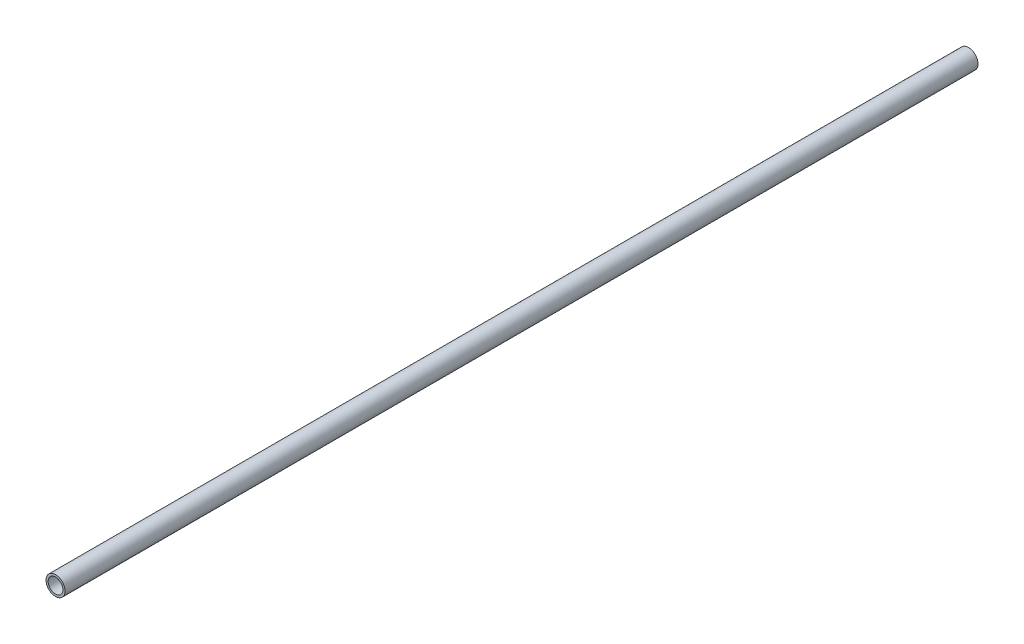
ISO-10303-21;
HEADER;
FILE_DESCRIPTION(('STEP AP214'),'2;1');
FILE_NAME('part.step','',(''),(''),'','','');
FILE_SCHEMA(('AUTOMOTIVE_DESIGN { 1 0 10303 214 1 1 1 1 }'));
ENDSEC;
DATA;
#1=APPLICATION_CONTEXT('core data for automotive mechanical design processes');
#2=APPLICATION_PROTOCOL_DEFINITION('international standard','automotive_design',2000,#1);
#3=PRODUCT_CONTEXT('',#1,'mechanical');
#4=PRODUCT('Part','Part','',(#3));
#5=PRODUCT_RELATED_PRODUCT_CATEGORY('part','',(#4));
#6=PRODUCT_DEFINITION_FORMATION('','',#4);
#7=PRODUCT_DEFINITION_CONTEXT('part definition',#1,'design');
#8=PRODUCT_DEFINITION('design','',#6,#7);
#9=PRODUCT_DEFINITION_SHAPE('','',#8);
#10=(LENGTH_UNIT() NAMED_UNIT(*) SI_UNIT(.MILLI.,.METRE.));
#11=(NAMED_UNIT(*) PLANE_ANGLE_UNIT() SI_UNIT($,.RADIAN.));
#12=(NAMED_UNIT(*) SI_UNIT($,.STERADIAN.) SOLID_ANGLE_UNIT());
#13=UNCERTAINTY_MEASURE_WITH_UNIT(LENGTH_MEASURE(1.E-05),#10,'distance_accuracy_value','');
#14=(GEOMETRIC_REPRESENTATION_CONTEXT(3) GLOBAL_UNCERTAINTY_ASSIGNED_CONTEXT((#13)) GLOBAL_UNIT_ASSIGNED_CONTEXT((#10,
#11,#12)) REPRESENTATION_CONTEXT('',''));
#15=CARTESIAN_POINT('',(0.,0.,0.));
#16=DIRECTION('',(0.,0.,1.));
#17=DIRECTION('',(1.,0.,0.));
#18=AXIS2_PLACEMENT_3D('',#15,#16,#17);
#19=CARTESIAN_POINT('',(0.,0.,152.4));
#20=DIRECTION('',(0.,0.,1.));
#21=DIRECTION('',(1.,0.,0.));
#22=AXIS2_PLACEMENT_3D('',#19,#20,#21);
#23=PLANE('',#22);
#24=CARTESIAN_POINT('',(0.,0.,152.4));
#25=DIRECTION('',(0.,0.,1.));
#26=DIRECTION('',(1.,0.,0.));
#27=AXIS2_PLACEMENT_3D('',#24,#25,#26);
#28=CIRCLE('',#27,3.175);
#29=CARTESIAN_POINT('',(-3.175,0.,152.4));
#30=VERTEX_POINT('',#29);
#31=EDGE_CURVE('E10',#30,#30,#28,.T.);
#32=ORIENTED_EDGE('',*,*,#31,.T.);
#33=EDGE_LOOP('',(#32));
#34=FACE_BOUND('',#33,.T.);
#35=CARTESIAN_POINT('',(0.,0.,152.4));
#36=DIRECTION('',(0.,0.,1.));
#37=DIRECTION('',(1.,0.,0.));
#38=AXIS2_PLACEMENT_3D('',#35,#36,#37);
#39=CIRCLE('',#38,2.4638);
#40=CARTESIAN_POINT('',(-2.4638,0.,152.4));
#41=VERTEX_POINT('',#40);
#42=EDGE_CURVE('E41',#41,#41,#39,.T.);
#43=ORIENTED_EDGE('',*,*,#42,.F.);
#44=EDGE_LOOP('',(#43));
#45=FACE_BOUND('',#44,.T.);
#46=ADVANCED_FACE('F30',(#34,#45),#23,.T.);
#47=CARTESIAN_POINT('',(0.,0.,-152.4));
#48=DIRECTION('',(0.,0.,1.));
#49=DIRECTION('',(1.,0.,0.));
#50=AXIS2_PLACEMENT_3D('',#47,#48,#49);
#51=PLANE('',#50);
#52=CARTESIAN_POINT('',(0.,0.,-152.4));
#53=DIRECTION('',(0.,0.,1.));
#54=DIRECTION('',(1.,0.,0.));
#55=AXIS2_PLACEMENT_3D('',#52,#53,#54);
#56=CIRCLE('',#55,3.175);
#57=CARTESIAN_POINT('',(-3.175,0.,-152.4));
#58=VERTEX_POINT('',#57);
#59=EDGE_CURVE('E34',#58,#58,#56,.T.);
#60=ORIENTED_EDGE('',*,*,#59,.F.);
#61=EDGE_LOOP('',(#60));
#62=FACE_BOUND('',#61,.T.);
#63=CARTESIAN_POINT('',(0.,0.,-152.4));
#64=DIRECTION('',(0.,0.,1.));
#65=DIRECTION('',(1.,0.,0.));
#66=AXIS2_PLACEMENT_3D('',#63,#64,#65);
#67=CIRCLE('',#66,2.4638);
#68=CARTESIAN_POINT('',(-2.4638,0.,-152.4));
#69=VERTEX_POINT('',#68);
#70=EDGE_CURVE('E43',#69,#69,#67,.T.);
#71=ORIENTED_EDGE('',*,*,#70,.T.);
#72=EDGE_LOOP('',(#71));
#73=FACE_BOUND('',#72,.T.);
#74=ADVANCED_FACE('F53',(#62,#73),#51,.F.);
#75=CARTESIAN_POINT('',(0.,0.,152.4));
#76=DIRECTION('',(0.,0.,-1.));
#77=DIRECTION('',(-1.,0.,0.));
#78=AXIS2_PLACEMENT_3D('',#75,#76,#77);
#79=CYLINDRICAL_SURFACE('',#78,3.175);
#80=CARTESIAN_POINT('',(-3.175,0.,152.4));
#81=CARTESIAN_POINT('',(-3.175,0.,149.225));
#82=CARTESIAN_POINT('',(-3.175,0.,146.05));
#83=CARTESIAN_POINT('',(-3.175,0.,139.7));
#84=CARTESIAN_POINT('',(-3.175,0.,136.525));
#85=CARTESIAN_POINT('',(-3.175,0.,130.175));
#86=CARTESIAN_POINT('',(-3.175,0.,127.));
#87=CARTESIAN_POINT('',(-3.175,0.,120.65));
#88=CARTESIAN_POINT('',(-3.175,0.,117.475));
#89=CARTESIAN_POINT('',(-3.175,0.,111.125));
#90=CARTESIAN_POINT('',(-3.175,0.,107.95));
#91=CARTESIAN_POINT('',(-3.175,0.,101.6));
#92=CARTESIAN_POINT('',(-3.175,0.,98.425));
#93=CARTESIAN_POINT('',(-3.175,0.,92.075));
#94=CARTESIAN_POINT('',(-3.175,0.,88.9));
#95=CARTESIAN_POINT('',(-3.175,0.,82.55));
#96=CARTESIAN_POINT('',(-3.175,0.,79.375));
#97=CARTESIAN_POINT('',(-3.175,0.,73.025));
#98=CARTESIAN_POINT('',(-3.175,0.,69.85));
#99=CARTESIAN_POINT('',(-3.175,0.,63.5));
#100=CARTESIAN_POINT('',(-3.175,0.,60.325));
#101=CARTESIAN_POINT('',(-3.175,0.,53.975));
#102=CARTESIAN_POINT('',(-3.175,0.,50.8));
#103=CARTESIAN_POINT('',(-3.175,0.,44.45));
#104=CARTESIAN_POINT('',(-3.175,0.,41.275));
#105=CARTESIAN_POINT('',(-3.175,0.,34.925));
#106=CARTESIAN_POINT('',(-3.175,0.,31.75));
#107=CARTESIAN_POINT('',(-3.175,0.,25.4));
#108=CARTESIAN_POINT('',(-3.175,0.,22.225));
#109=CARTESIAN_POINT('',(-3.175,0.,15.875));
#110=CARTESIAN_POINT('',(-3.175,0.,12.7));
#111=CARTESIAN_POINT('',(-3.175,0.,6.34999999999998));
#112=CARTESIAN_POINT('',(-3.175,0.,3.17499999999997));
#113=CARTESIAN_POINT('',(-3.175,0.,-3.17500000000003));
#114=CARTESIAN_POINT('',(-3.175,0.,-6.35000000000003));
#115=CARTESIAN_POINT('',(-3.175,0.,-12.7));
#116=CARTESIAN_POINT('',(-3.175,0.,-15.875));
#117=CARTESIAN_POINT('',(-3.175,0.,-22.225));
#118=CARTESIAN_POINT('',(-3.175,0.,-25.4));
#119=CARTESIAN_POINT('',(-3.175,0.,-31.75));
#120=CARTESIAN_POINT('',(-3.175,0.,-34.925));
#121=CARTESIAN_POINT('',(-3.175,0.,-41.275));
#122=CARTESIAN_POINT('',(-3.175,0.,-44.45));
#123=CARTESIAN_POINT('',(-3.175,0.,-50.8));
#124=CARTESIAN_POINT('',(-3.175,0.,-53.975));
#125=CARTESIAN_POINT('',(-3.175,0.,-60.325));
#126=CARTESIAN_POINT('',(-3.175,0.,-63.5));
#127=CARTESIAN_POINT('',(-3.175,0.,-69.85));
#128=CARTESIAN_POINT('',(-3.175,0.,-73.025));
#129=CARTESIAN_POINT('',(-3.175,0.,-79.375));
#130=CARTESIAN_POINT('',(-3.175,0.,-82.5500000000001));
#131=CARTESIAN_POINT('',(-3.175,0.,-88.9));
#132=CARTESIAN_POINT('',(-3.175,0.,-92.0750000000001));
#133=CARTESIAN_POINT('',(-3.175,0.,-98.425));
#134=CARTESIAN_POINT('',(-3.175,0.,-101.6));
#135=CARTESIAN_POINT('',(-3.175,0.,-107.95));
#136=CARTESIAN_POINT('',(-3.175,0.,-111.125));
#137=CARTESIAN_POINT('',(-3.175,0.,-117.475));
#138=CARTESIAN_POINT('',(-3.175,0.,-120.65));
#139=CARTESIAN_POINT('',(-3.175,0.,-127.));
#140=CARTESIAN_POINT('',(-3.175,0.,-130.175));
#141=CARTESIAN_POINT('',(-3.175,0.,-136.525));
#142=CARTESIAN_POINT('',(-3.175,0.,-139.7));
#143=CARTESIAN_POINT('',(-3.175,0.,-146.05));
#144=CARTESIAN_POINT('',(-3.175,0.,-149.225));
#145=CARTESIAN_POINT('',(-3.175,0.,-152.4));
#146=B_SPLINE_CURVE_WITH_KNOTS('',3,(#80,#81,#82,#83,#84,#85,#86,#87,#88,#89,#90,#91,#92,#93,
#94,#95,#96,#97,#98,#99,#100,#101,#102,#103,#104,#105,#106,#107,#108,#109,#110,#111,#112,#113,
#114,#115,#116,#117,#118,#119,#120,#121,#122,#123,#124,#125,#126,#127,#128,#129,#130,#131,#132,
#133,#134,#135,#136,#137,#138,#139,#140,#141,#142,#143,#144,#145),.UNSPECIFIED.,.F.,.F.,(4,2,2,
2,2,2,2,2,2,2,2,2,2,2,2,2,2,2,2,2,2,2,2,2,2,2,2,2,2,2,2,2,4),(0.,9.52499999999998,19.05,28.575,
38.1,47.625,57.15,66.675,76.2,85.725,95.25,104.775,114.3,123.825,133.35,142.875,152.4,161.925,
171.45,180.975,190.5,200.025,209.55,219.075,228.6,238.125,247.65,257.175,266.7,276.225,285.75,
295.275,304.8),.UNSPECIFIED.);
#147=EDGE_CURVE('BSEAM32',#30,#58,#146,.T.);
#148=ORIENTED_EDGE('',*,*,#31,.F.);
#149=ORIENTED_EDGE('',*,*,#59,.T.);
#150=ORIENTED_EDGE('',*,*,#147,.T.);
#151=ORIENTED_EDGE('',*,*,#147,.F.);
#152=EDGE_LOOP('',(#148,#150,#149,#151));
#153=FACE_BOUND('',#152,.T.);
#154=ADVANCED_FACE('F32',(#153),#79,.T.);
#155=CARTESIAN_POINT('',(0.,0.,152.4));
#156=DIRECTION('',(0.,0.,-1.));
#157=DIRECTION('',(-1.,0.,0.));
#158=AXIS2_PLACEMENT_3D('',#155,#156,#157);
#159=CYLINDRICAL_SURFACE('',#158,2.4638);
#160=CARTESIAN_POINT('',(-2.4638,0.,152.4));
#161=CARTESIAN_POINT('',(-2.4638,0.,149.225));
#162=CARTESIAN_POINT('',(-2.4638,0.,146.05));
#163=CARTESIAN_POINT('',(-2.4638,0.,139.7));
#164=CARTESIAN_POINT('',(-2.4638,0.,136.525));
#165=CARTESIAN_POINT('',(-2.4638,0.,130.175));
#166=CARTESIAN_POINT('',(-2.4638,0.,127.));
#167=CARTESIAN_POINT('',(-2.4638,0.,120.65));
#168=CARTESIAN_POINT('',(-2.4638,0.,117.475));
#169=CARTESIAN_POINT('',(-2.4638,0.,111.125));
#170=CARTESIAN_POINT('',(-2.4638,0.,107.95));
#171=CARTESIAN_POINT('',(-2.4638,0.,101.6));
#172=CARTESIAN_POINT('',(-2.4638,0.,98.425));
#173=CARTESIAN_POINT('',(-2.4638,0.,92.075));
#174=CARTESIAN_POINT('',(-2.4638,0.,88.9));
#175=CARTESIAN_POINT('',(-2.4638,0.,82.55));
#176=CARTESIAN_POINT('',(-2.4638,0.,79.375));
#177=CARTESIAN_POINT('',(-2.4638,0.,73.025));
#178=CARTESIAN_POINT('',(-2.4638,0.,69.85));
#179=CARTESIAN_POINT('',(-2.4638,0.,63.5));
#180=CARTESIAN_POINT('',(-2.4638,0.,60.325));
#181=CARTESIAN_POINT('',(-2.4638,0.,53.975));
#182=CARTESIAN_POINT('',(-2.4638,0.,50.8));
#183=CARTESIAN_POINT('',(-2.4638,0.,44.45));
#184=CARTESIAN_POINT('',(-2.4638,0.,41.275));
#185=CARTESIAN_POINT('',(-2.4638,0.,34.925));
#186=CARTESIAN_POINT('',(-2.4638,0.,31.75));
#187=CARTESIAN_POINT('',(-2.4638,0.,25.4));
#188=CARTESIAN_POINT('',(-2.4638,0.,22.225));
#189=CARTESIAN_POINT('',(-2.4638,0.,15.875));
#190=CARTESIAN_POINT('',(-2.4638,0.,12.7));
#191=CARTESIAN_POINT('',(-2.4638,0.,6.34999999999998));
#192=CARTESIAN_POINT('',(-2.4638,0.,3.17499999999997));
#193=CARTESIAN_POINT('',(-2.4638,0.,-3.17500000000003));
#194=CARTESIAN_POINT('',(-2.4638,0.,-6.35000000000003));
#195=CARTESIAN_POINT('',(-2.4638,0.,-12.7));
#196=CARTESIAN_POINT('',(-2.4638,0.,-15.875));
#197=CARTESIAN_POINT('',(-2.4638,0.,-22.225));
#198=CARTESIAN_POINT('',(-2.4638,0.,-25.4));
#199=CARTESIAN_POINT('',(-2.4638,0.,-31.75));
#200=CARTESIAN_POINT('',(-2.4638,0.,-34.925));
#201=CARTESIAN_POINT('',(-2.4638,0.,-41.275));
#202=CARTESIAN_POINT('',(-2.4638,0.,-44.45));
#203=CARTESIAN_POINT('',(-2.4638,0.,-50.8));
#204=CARTESIAN_POINT('',(-2.4638,0.,-53.975));
#205=CARTESIAN_POINT('',(-2.4638,0.,-60.325));
#206=CARTESIAN_POINT('',(-2.4638,0.,-63.5));
#207=CARTESIAN_POINT('',(-2.4638,0.,-69.85));
#208=CARTESIAN_POINT('',(-2.4638,0.,-73.025));
#209=CARTESIAN_POINT('',(-2.4638,0.,-79.375));
#210=CARTESIAN_POINT('',(-2.4638,0.,-82.5500000000001));
#211=CARTESIAN_POINT('',(-2.4638,0.,-88.9));
#212=CARTESIAN_POINT('',(-2.4638,0.,-92.0750000000001));
#213=CARTESIAN_POINT('',(-2.4638,0.,-98.425));
#214=CARTESIAN_POINT('',(-2.4638,0.,-101.6));
#215=CARTESIAN_POINT('',(-2.4638,0.,-107.95));
#216=CARTESIAN_POINT('',(-2.4638,0.,-111.125));
#217=CARTESIAN_POINT('',(-2.4638,0.,-117.475));
#218=CARTESIAN_POINT('',(-2.4638,0.,-120.65));
#219=CARTESIAN_POINT('',(-2.4638,0.,-127.));
#220=CARTESIAN_POINT('',(-2.4638,0.,-130.175));
#221=CARTESIAN_POINT('',(-2.4638,0.,-136.525));
#222=CARTESIAN_POINT('',(-2.4638,0.,-139.7));
#223=CARTESIAN_POINT('',(-2.4638,0.,-146.05));
#224=CARTESIAN_POINT('',(-2.4638,0.,-149.225));
#225=CARTESIAN_POINT('',(-2.4638,0.,-152.4));
#226=B_SPLINE_CURVE_WITH_KNOTS('',3,(#160,#161,#162,#163,#164,#165,#166,#167,#168,#169,#170,
#171,#172,#173,#174,#175,#176,#177,#178,#179,#180,#181,#182,#183,#184,#185,#186,#187,#188,#189,
#190,#191,#192,#193,#194,#195,#196,#197,#198,#199,#200,#201,#202,#203,#204,#205,#206,#207,#208,
#209,#210,#211,#212,#213,#214,#215,#216,#217,#218,#219,#220,#221,#222,#223,#224,#225),
.UNSPECIFIED.,.F.,.F.,(4,2,2,2,2,2,2,2,2,2,2,2,2,2,2,2,2,2,2,2,2,2,2,2,2,2,2,2,2,2,2,2,4),(0.,
9.52499999999998,19.05,28.575,38.1,47.625,57.15,66.675,76.2,85.725,95.25,104.775,114.3,123.825,
133.35,142.875,152.4,161.925,171.45,180.975,190.5,200.025,209.55,219.075,228.6,238.125,247.65,
257.175,266.7,276.225,285.75,295.275,304.8),.UNSPECIFIED.);
#227=EDGE_CURVE('BSEAM49',#41,#69,#226,.T.);
#228=ORIENTED_EDGE('',*,*,#42,.T.);
#229=ORIENTED_EDGE('',*,*,#70,.F.);
#230=ORIENTED_EDGE('',*,*,#227,.T.);
#231=ORIENTED_EDGE('',*,*,#227,.F.);
#232=EDGE_LOOP('',(#228,#230,#229,#231));
#233=FACE_BOUND('',#232,.T.);
#234=ADVANCED_FACE('F49',(#233),#159,.F.);
#235=CLOSED_SHELL('',(#46,#74,#154,#234));
#236=MANIFOLD_SOLID_BREP('B2',#235);
#237=ADVANCED_BREP_SHAPE_REPRESENTATION('',(#18,#236),#14);
#238=SHAPE_DEFINITION_REPRESENTATION(#9,#237);
ENDSEC;
END-ISO-10303-21;
